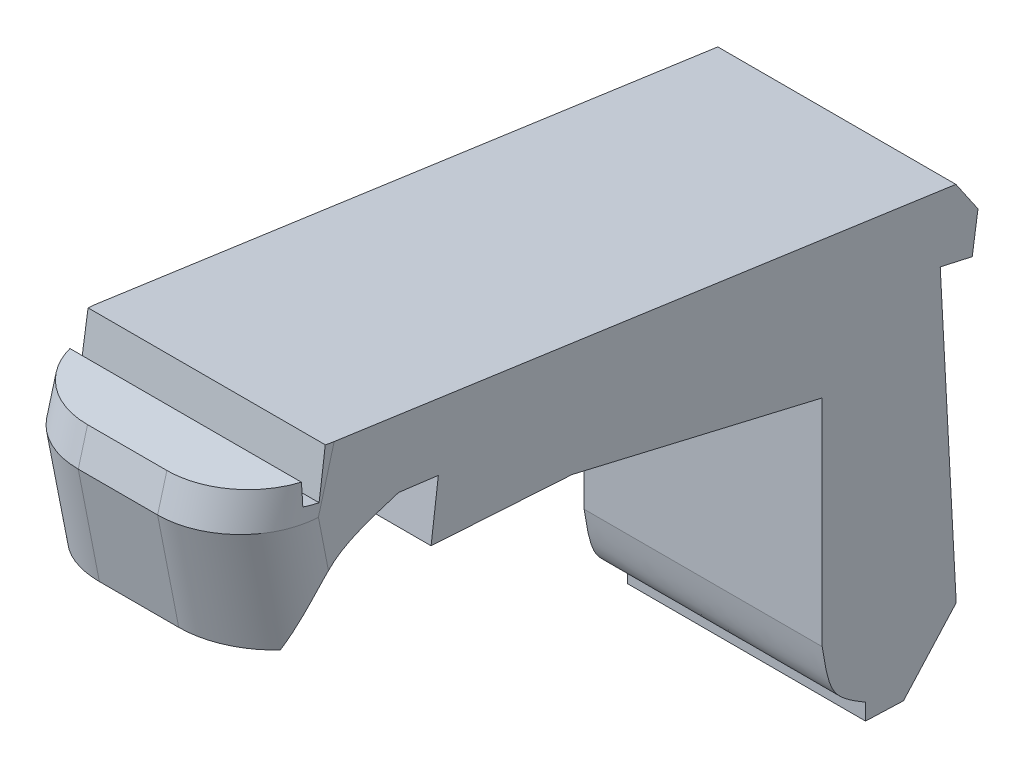
ISO-10303-21;
HEADER;
FILE_DESCRIPTION(('STEP AP214'),'2;1');
FILE_NAME('part.step','',(''),(''),'','','');
FILE_SCHEMA(('AUTOMOTIVE_DESIGN { 1 0 10303 214 1 1 1 1 }'));
ENDSEC;
DATA;
#1=APPLICATION_CONTEXT('core data for automotive mechanical design processes');
#2=APPLICATION_PROTOCOL_DEFINITION('international standard','automotive_design',2000,#1);
#3=PRODUCT_CONTEXT('',#1,'mechanical');
#4=PRODUCT('Part','Part','',(#3));
#5=PRODUCT_RELATED_PRODUCT_CATEGORY('part','',(#4));
#6=PRODUCT_DEFINITION_FORMATION('','',#4);
#7=PRODUCT_DEFINITION_CONTEXT('part definition',#1,'design');
#8=PRODUCT_DEFINITION('design','',#6,#7);
#9=PRODUCT_DEFINITION_SHAPE('','',#8);
#10=(LENGTH_UNIT() NAMED_UNIT(*) SI_UNIT(.MILLI.,.METRE.));
#11=(NAMED_UNIT(*) PLANE_ANGLE_UNIT() SI_UNIT($,.RADIAN.));
#12=(NAMED_UNIT(*) SI_UNIT($,.STERADIAN.) SOLID_ANGLE_UNIT());
#13=UNCERTAINTY_MEASURE_WITH_UNIT(LENGTH_MEASURE(1.E-05),#10,'distance_accuracy_value','');
#14=(GEOMETRIC_REPRESENTATION_CONTEXT(3) GLOBAL_UNCERTAINTY_ASSIGNED_CONTEXT((#13)) GLOBAL_UNIT_ASSIGNED_CONTEXT((#10,
#11,#12)) REPRESENTATION_CONTEXT('',''));
#15=CARTESIAN_POINT('',(0.,0.,0.));
#16=DIRECTION('',(0.,0.,1.));
#17=DIRECTION('',(1.,0.,0.));
#18=AXIS2_PLACEMENT_3D('',#15,#16,#17);
#19=CARTESIAN_POINT('',(457.2,-234.202580834707,-700.473544690758));
#20=DIRECTION('',(0.,0.147906441094349,0.989001357270456));
#21=DIRECTION('',(0.,-0.989001357270456,0.147906441094349));
#22=AXIS2_PLACEMENT_3D('',#19,#20,#21);
#23=PLANE('',#22);
#24=DIRECTION('',(0.,0.989001357270456,-0.147906441094349));
#25=VECTOR('',#24,1.);
#26=CARTESIAN_POINT('',(0.,-234.202580834707,-700.473544690758));
#27=LINE('',#26,#25);
#28=CARTESIAN_POINT('',(0.,-234.202580834707,-700.473544690758));
#29=VERTEX_POINT('',#28);
#30=CARTESIAN_POINT('',(0.,-160.150025750479,-711.548200752586));
#31=VERTEX_POINT('',#30);
#32=EDGE_CURVE('E240',#29,#31,#27,.T.);
#33=ORIENTED_EDGE('',*,*,#32,.T.);
#34=DIRECTION('',(-1.,0.,0.));
#35=VECTOR('',#34,1.);
#36=CARTESIAN_POINT('',(457.2,-160.150025750479,-711.548200752586));
#37=LINE('',#36,#35);
#38=CARTESIAN_POINT('',(457.2,-160.150025750479,-711.548200752586));
#39=VERTEX_POINT('',#38);
#40=EDGE_CURVE('E220',#39,#31,#37,.T.);
#41=ORIENTED_EDGE('',*,*,#40,.F.);
#42=DIRECTION('',(0.,0.989001357270456,-0.147906441094349));
#43=VECTOR('',#42,1.);
#44=CARTESIAN_POINT('',(457.2,-234.202580834707,-700.473544690758));
#45=LINE('',#44,#43);
#46=CARTESIAN_POINT('',(457.2,-234.202580834707,-700.473544690758));
#47=VERTEX_POINT('',#46);
#48=EDGE_CURVE('E227',#47,#39,#45,.T.);
#49=ORIENTED_EDGE('',*,*,#48,.F.);
#50=DIRECTION('',(-1.,0.,0.));
#51=VECTOR('',#50,1.);
#52=CARTESIAN_POINT('',(457.2,-234.202580834707,-700.473544690758));
#53=LINE('',#52,#51);
#54=EDGE_CURVE('E509',#47,#29,#53,.T.);
#55=ORIENTED_EDGE('',*,*,#54,.T.);
#56=EDGE_LOOP('',(#33,#41,#49,#55));
#57=FACE_BOUND('',#56,.T.);
#58=ADVANCED_FACE('F44',(#57),#23,.F.);
#59=CARTESIAN_POINT('',(457.2,-160.150025750479,-711.548200752586));
#60=DIRECTION('',(0.,-0.565365169985274,0.824840726787616));
#61=DIRECTION('',(0.,-0.824840726787616,-0.565365169985274));
#62=AXIS2_PLACEMENT_3D('',#59,#60,#61);
#63=PLANE('',#62);
#64=DIRECTION('',(0.,0.824840726787616,0.565365169985274));
#65=VECTOR('',#64,1.);
#66=CARTESIAN_POINT('',(0.,-160.150025750479,-711.548200752586));
#67=LINE('',#66,#65);
#68=CARTESIAN_POINT('',(0.,-98.1665415570775,-669.063267674949));
#69=VERTEX_POINT('',#68);
#70=EDGE_CURVE('E424',#31,#69,#67,.T.);
#71=ORIENTED_EDGE('',*,*,#70,.T.);
#72=DIRECTION('',(-1.,0.,0.));
#73=VECTOR('',#72,1.);
#74=CARTESIAN_POINT('',(457.2,-98.1665415570775,-669.063267674949));
#75=LINE('',#74,#73);
#76=CARTESIAN_POINT('',(457.2,-98.1665415570775,-669.063267674949));
#77=VERTEX_POINT('',#76);
#78=EDGE_CURVE('E223',#77,#69,#75,.T.);
#79=ORIENTED_EDGE('',*,*,#78,.F.);
#80=DIRECTION('',(0.,0.824840726787616,0.565365169985274));
#81=VECTOR('',#80,1.);
#82=CARTESIAN_POINT('',(457.2,-160.150025750479,-711.548200752586));
#83=LINE('',#82,#81);
#84=EDGE_CURVE('E216',#39,#77,#83,.T.);
#85=ORIENTED_EDGE('',*,*,#84,.F.);
#86=ORIENTED_EDGE('',*,*,#40,.T.);
#87=EDGE_LOOP('',(#71,#79,#85,#86));
#88=FACE_BOUND('',#87,.T.);
#89=ADVANCED_FACE('F218',(#88),#63,.F.);
#90=CARTESIAN_POINT('',(457.2,-98.1665415570775,-669.063267674949));
#91=DIRECTION('',(0.,-0.990108755440393,0.140302004263217));
#92=DIRECTION('',(0.,-0.140302004263217,-0.990108755440393));
#93=AXIS2_PLACEMENT_3D('',#90,#91,#92);
#94=PLANE('',#93);
#95=DIRECTION('',(0.,0.140302004263217,0.990108755440393));
#96=VECTOR('',#95,1.);
#97=CARTESIAN_POINT('',(0.,-98.1665415570775,-669.063267674949));
#98=LINE('',#97,#96);
#99=CARTESIAN_POINT('',(0.,71.0241120864936,524.912174022294));
#100=VERTEX_POINT('',#99);
#101=EDGE_CURVE('E462',#69,#100,#98,.T.);
#102=ORIENTED_EDGE('',*,*,#101,.T.);
#103=CARTESIAN_POINT('',(152.4,71.0241120864935,524.912174022294));
#104=DIRECTION('',(0.,-0.990108755440393,0.140302004263217));
#105=DIRECTION('',(0.,0.140302004263217,0.990108755440393));
#106=AXIS2_PLACEMENT_3D('',#103,#104,#105);
#107=ELLIPSE('',#106,153.614203620761,152.4);
#108=CARTESIAN_POINT('',(0.869292960390344,73.3228033929576,541.133997798345));
#109=VERTEX_POINT('',#108);
#110=EDGE_CURVE('E377',#100,#109,#107,.F.);
#111=ORIENTED_EDGE('',*,*,#110,.T.);
#112=DIRECTION('',(-1.,0.,0.));
#113=VECTOR('',#112,1.);
#114=CARTESIAN_POINT('',(457.2,73.3228033929576,541.133997798345));
#115=LINE('',#114,#113);
#116=CARTESIAN_POINT('',(456.33070703961,73.3228033929576,541.133997798345));
#117=VERTEX_POINT('',#116);
#118=EDGE_CURVE('E248',#117,#109,#115,.T.);
#119=ORIENTED_EDGE('',*,*,#118,.F.);
#120=CARTESIAN_POINT('',(304.8,71.0241120864935,524.912174022294));
#121=DIRECTION('',(0.,-0.990108755440393,0.140302004263217));
#122=DIRECTION('',(0.,-0.140302004263217,-0.990108755440393));
#123=AXIS2_PLACEMENT_3D('',#120,#121,#122);
#124=ELLIPSE('',#123,153.614203620761,152.4);
#125=CARTESIAN_POINT('',(457.2,71.0241120864936,524.912174022294));
#126=VERTEX_POINT('',#125);
#127=EDGE_CURVE('E389',#117,#126,#124,.F.);
#128=ORIENTED_EDGE('',*,*,#127,.T.);
#129=DIRECTION('',(0.,0.140302004263217,0.990108755440393));
#130=VECTOR('',#129,1.);
#131=CARTESIAN_POINT('',(457.2,-98.1665415570775,-669.063267674949));
#132=LINE('',#131,#130);
#133=EDGE_CURVE('E226',#77,#126,#132,.T.);
#134=ORIENTED_EDGE('',*,*,#133,.F.);
#135=ORIENTED_EDGE('',*,*,#78,.T.);
#136=EDGE_LOOP('',(#102,#111,#119,#128,#134,#135));
#137=FACE_BOUND('',#136,.T.);
#138=ADVANCED_FACE('F358',(#137),#94,.F.);
#139=CARTESIAN_POINT('',(457.2,73.3228033929576,541.133997798345));
#140=DIRECTION('',(0.,-0.140302004263217,-0.990108755440393));
#141=DIRECTION('',(0.,0.990108755440393,-0.140302004263217));
#142=AXIS2_PLACEMENT_3D('',#139,#140,#141);
#143=PLANE('',#142);
#144=ORIENTED_EDGE('',*,*,#118,.T.);
#145=CARTESIAN_POINT('',(152.4,-54.930361816575,559.307936805677));
#146=DIRECTION('',(0.,-0.140302004263217,-0.990108755440393));
#147=DIRECTION('',(0.,-0.990108755440393,0.140302004263217));
#148=AXIS2_PLACEMENT_3D('',#145,#146,#147);
#149=ELLIPSE('',#148,1214.50634080921,152.4);
#150=CARTESIAN_POINT('',(0.0789153787404406,-16.2375941304493,553.825031188465));
#151=VERTEX_POINT('',#150);
#152=EDGE_CURVE('E382',#109,#151,#149,.F.);
#153=ORIENTED_EDGE('',*,*,#152,.T.);
#154=DIRECTION('',(-1.,0.,0.));
#155=VECTOR('',#154,1.);
#156=CARTESIAN_POINT('',(457.2,-16.2375941304493,553.825031188465));
#157=LINE('',#156,#155);
#158=CARTESIAN_POINT('',(457.12108462126,-16.2375941304493,553.825031188465));
#159=VERTEX_POINT('',#158);
#160=EDGE_CURVE('E574',#159,#151,#157,.T.);
#161=ORIENTED_EDGE('',*,*,#160,.F.);
#162=CARTESIAN_POINT('',(304.8,-54.9303618165749,559.307936805677));
#163=DIRECTION('',(0.,-0.140302004263217,-0.990108755440393));
#164=DIRECTION('',(0.,0.990108755440393,-0.140302004263217));
#165=AXIS2_PLACEMENT_3D('',#162,#163,#164);
#166=ELLIPSE('',#165,1214.50634080921,152.4);
#167=EDGE_CURVE('E388',#159,#117,#166,.F.);
#168=ORIENTED_EDGE('',*,*,#167,.T.);
#169=EDGE_LOOP('',(#144,#153,#161,#168));
#170=FACE_BOUND('',#169,.T.);
#171=ADVANCED_FACE('F579',(#170),#143,.F.);
#172=CARTESIAN_POINT('',(457.2,-16.2375941304493,553.825031188465));
#173=DIRECTION('',(0.,-0.985030467155704,0.172380331752249));
#174=DIRECTION('',(0.,-0.172380331752249,-0.985030467155704));
#175=AXIS2_PLACEMENT_3D('',#172,#173,#174);
#176=PLANE('',#175);
#177=ORIENTED_EDGE('',*,*,#160,.T.);
#178=CARTESIAN_POINT('',(152.4,-17.0866069004241,548.973529645752));
#179=DIRECTION('',(0.,-0.985030467155704,0.172380331752249));
#180=DIRECTION('',(0.,0.172380331752249,0.985030467155704));
#181=AXIS2_PLACEMENT_3D('',#178,#179,#180);
#182=ELLIPSE('',#181,153.066235733513,152.4);
#183=CARTESIAN_POINT('',(3.58685019918575,-11.3957753505241,581.492567073753));
#184=VERTEX_POINT('',#183);
#185=EDGE_CURVE('E403',#151,#184,#182,.F.);
#186=ORIENTED_EDGE('',*,*,#185,.T.);
#187=DIRECTION('',(-1.,0.,0.));
#188=VECTOR('',#187,1.);
#189=CARTESIAN_POINT('',(457.2,-11.3957753505241,581.492567073753));
#190=LINE('',#189,#188);
#191=CARTESIAN_POINT('',(453.613149800814,-11.3957753505241,581.492567073753));
#192=VERTEX_POINT('',#191);
#193=EDGE_CURVE('E571',#192,#184,#190,.T.);
#194=ORIENTED_EDGE('',*,*,#193,.F.);
#195=CARTESIAN_POINT('',(304.8,-17.0866069004242,548.973529645752));
#196=DIRECTION('',(0.,-0.985030467155704,0.172380331752249));
#197=DIRECTION('',(0.,-0.172380331752249,-0.985030467155704));
#198=AXIS2_PLACEMENT_3D('',#195,#196,#197);
#199=ELLIPSE('',#198,153.066235733513,152.4);
#200=EDGE_CURVE('E400',#192,#159,#199,.F.);
#201=ORIENTED_EDGE('',*,*,#200,.T.);
#202=EDGE_LOOP('',(#177,#186,#194,#201));
#203=FACE_BOUND('',#202,.T.);
#204=ADVANCED_FACE('F585',(#203),#176,.F.);
#205=CARTESIAN_POINT('',(457.2,-11.3957753505241,581.492567073753));
#206=DIRECTION('',(0.,0.,1.));
#207=DIRECTION('',(1.,0.,0.));
#208=AXIS2_PLACEMENT_3D('',#205,#206,#207);
#209=PLANE('',#208);
#210=ORIENTED_EDGE('',*,*,#193,.T.);
#211=CARTESIAN_POINT('',(152.4,-136.168665841031,581.492567073753));
#212=DIRECTION('',(0.,0.,1.));
#213=DIRECTION('',(0.,-1.,0.));
#214=AXIS2_PLACEMENT_3D('',#211,#212,#213);
#215=ELLIPSE('',#214,578.510997998352,152.4);
#216=CARTESIAN_POINT('',(6.31289711011646,28.6110667005303,581.492567073753));
#217=VERTEX_POINT('',#216);
#218=EDGE_CURVE('E68',#184,#217,#215,.F.);
#219=ORIENTED_EDGE('',*,*,#218,.T.);
#220=DIRECTION('',(-1.,0.,0.));
#221=VECTOR('',#220,1.);
#222=CARTESIAN_POINT('',(457.2,28.6110667005303,581.492567073753));
#223=LINE('',#222,#221);
#224=CARTESIAN_POINT('',(450.887102889884,28.6110667005303,581.492567073753));
#225=VERTEX_POINT('',#224);
#226=EDGE_CURVE('E568',#225,#217,#223,.T.);
#227=ORIENTED_EDGE('',*,*,#226,.F.);
#228=CARTESIAN_POINT('',(304.8,-136.168665841031,581.492567073753));
#229=DIRECTION('',(0.,0.,1.));
#230=DIRECTION('',(0.,1.,0.));
#231=AXIS2_PLACEMENT_3D('',#228,#229,#230);
#232=ELLIPSE('',#231,578.510997998352,152.4);
#233=EDGE_CURVE('E406',#225,#192,#232,.F.);
#234=ORIENTED_EDGE('',*,*,#233,.T.);
#235=EDGE_LOOP('',(#210,#219,#227,#234));
#236=FACE_BOUND('',#235,.T.);
#237=ADVANCED_FACE('F586',(#236),#209,.F.);
#238=CARTESIAN_POINT('',(457.2,28.6110667005303,581.492567073753));
#239=DIRECTION('',(0.,-0.999735868986412,0.0229824337698023));
#240=DIRECTION('',(0.,-0.0229824337698023,-0.999735868986412));
#241=AXIS2_PLACEMENT_3D('',#238,#239,#240);
#242=PLANE('',#241);
#243=ORIENTED_EDGE('',*,*,#226,.T.);
#244=CARTESIAN_POINT('',(152.4,27.5830787468075,536.77509108681));
#245=DIRECTION('',(0.,-0.999735868986412,0.0229824337698023));
#246=DIRECTION('',(0.,0.0229824337698023,0.999735868986412));
#247=AXIS2_PLACEMENT_3D('',#244,#245,#246);
#248=ELLIPSE('',#247,157.036220524386,152.4);
#249=CARTESIAN_POINT('',(152.4,31.1921532844693,693.769833475099));
#250=VERTEX_POINT('',#249);
#251=EDGE_CURVE('E414',#217,#250,#248,.F.);
#252=ORIENTED_EDGE('',*,*,#251,.T.);
#253=DIRECTION('',(-1.,0.,0.));
#254=VECTOR('',#253,1.);
#255=CARTESIAN_POINT('',(457.2,31.1921532844693,693.769833475099));
#256=LINE('',#255,#254);
#257=CARTESIAN_POINT('',(304.8,31.1921532844693,693.769833475099));
#258=VERTEX_POINT('',#257);
#259=EDGE_CURVE('E565',#258,#250,#256,.T.);
#260=ORIENTED_EDGE('',*,*,#259,.F.);
#261=CARTESIAN_POINT('',(304.8,27.5830787468075,536.77509108681));
#262=DIRECTION('',(0.,-0.999735868986412,0.0229824337698023));
#263=DIRECTION('',(0.,-0.0229824337698023,-0.999735868986412));
#264=AXIS2_PLACEMENT_3D('',#261,#262,#263);
#265=ELLIPSE('',#264,157.036220524386,152.4);
#266=EDGE_CURVE('E411',#258,#225,#265,.F.);
#267=ORIENTED_EDGE('',*,*,#266,.T.);
#268=EDGE_LOOP('',(#243,#252,#260,#267));
#269=FACE_BOUND('',#268,.T.);
#270=ADVANCED_FACE('F590',(#269),#242,.F.);
#271=CARTESIAN_POINT('',(457.2,31.1921532844693,693.769833475099));
#272=DIRECTION('',(0.,-0.263434922632939,-0.96467716959477));
#273=DIRECTION('',(0.,0.964677169594771,-0.263434922632939));
#274=AXIS2_PLACEMENT_3D('',#271,#272,#273);
#275=PLANE('',#274);
#276=ORIENTED_EDGE('',*,*,#259,.T.);
#277=DIRECTION('',(0.,-0.964677169594771,0.263434922632939));
#278=VECTOR('',#277,1.);
#279=CARTESIAN_POINT('',(152.4,31.1921532844693,693.769833475099));
#280=LINE('',#279,#278);
#281=CARTESIAN_POINT('',(152.4,-33.910775567373,711.548200752586));
#282=VERTEX_POINT('',#281);
#283=EDGE_CURVE('E394',#250,#282,#280,.T.);
#284=ORIENTED_EDGE('',*,*,#283,.T.);
#285=DIRECTION('',(-1.,0.,0.));
#286=VECTOR('',#285,1.);
#287=CARTESIAN_POINT('',(457.2,-33.910775567373,711.548200752586));
#288=LINE('',#287,#286);
#289=CARTESIAN_POINT('',(304.8,-33.910775567373,711.548200752586));
#290=VERTEX_POINT('',#289);
#291=EDGE_CURVE('E561',#290,#282,#288,.T.);
#292=ORIENTED_EDGE('',*,*,#291,.F.);
#293=DIRECTION('',(0.,-0.964677169594771,0.263434922632939));
#294=VECTOR('',#293,1.);
#295=CARTESIAN_POINT('',(304.8,31.1921532844693,693.769833475099));
#296=LINE('',#295,#294);
#297=EDGE_CURVE('E435',#290,#258,#296,.F.);
#298=ORIENTED_EDGE('',*,*,#297,.T.);
#299=EDGE_LOOP('',(#276,#284,#292,#298));
#300=FACE_BOUND('',#299,.T.);
#301=ADVANCED_FACE('F591',(#300),#275,.F.);
#302=CARTESIAN_POINT('',(457.2,-33.910775567373,711.548200752586));
#303=DIRECTION('',(0.,0.191799309114282,-0.981434167442363));
#304=DIRECTION('',(0.,0.981434167442363,0.191799309114282));
#305=AXIS2_PLACEMENT_3D('',#302,#303,#304);
#306=PLANE('',#305);
#307=ORIENTED_EDGE('',*,*,#291,.T.);
#308=DIRECTION('',(0.,-0.981434167442363,-0.191799309114282));
#309=VECTOR('',#308,1.);
#310=CARTESIAN_POINT('',(152.4,-33.910775567373,711.548200752586));
#311=LINE('',#310,#309);
#312=CARTESIAN_POINT('',(152.4,-241.199727441152,671.038221504539));
#313=VERTEX_POINT('',#312);
#314=EDGE_CURVE('E246',#282,#313,#311,.T.);
#315=ORIENTED_EDGE('',*,*,#314,.T.);
#316=DIRECTION('',(-1.,0.,0.));
#317=VECTOR('',#316,1.);
#318=CARTESIAN_POINT('',(457.2,-241.199727441152,671.038221504539));
#319=LINE('',#318,#317);
#320=CARTESIAN_POINT('',(304.8,-241.199727441152,671.038221504539));
#321=VERTEX_POINT('',#320);
#322=EDGE_CURVE('E557',#321,#313,#319,.T.);
#323=ORIENTED_EDGE('',*,*,#322,.F.);
#324=DIRECTION('',(0.,-0.981434167442363,-0.191799309114282));
#325=VECTOR('',#324,1.);
#326=CARTESIAN_POINT('',(304.8,-33.910775567373,711.548200752586));
#327=LINE('',#326,#325);
#328=EDGE_CURVE('E242',#321,#290,#327,.F.);
#329=ORIENTED_EDGE('',*,*,#328,.T.);
#330=EDGE_LOOP('',(#307,#315,#323,#329));
#331=FACE_BOUND('',#330,.T.);
#332=ADVANCED_FACE('F593',(#331),#306,.F.);
#333=CARTESIAN_POINT('',(457.2,-241.199727441152,671.038221504539));
#334=DIRECTION('',(0.,0.991075478634725,-0.133301896644238));
#335=DIRECTION('',(0.,0.133301896644238,0.991075478634725));
#336=AXIS2_PLACEMENT_3D('',#333,#334,#335);
#337=PLANE('',#336);
#338=ORIENTED_EDGE('',*,*,#322,.T.);
#339=CARTESIAN_POINT('',(152.4,-262.649452662792,511.56339612111));
#340=DIRECTION('',(0.,0.991075478634725,-0.133301896644238));
#341=DIRECTION('',(0.,-0.133301896644238,-0.991075478634725));
#342=AXIS2_PLACEMENT_3D('',#339,#340,#341);
#343=ELLIPSE('',#342,160.910877951613,152.4);
#344=CARTESIAN_POINT('',(26.6621561789793,-250.529122735342,601.675855781883));
#345=VERTEX_POINT('',#344);
#346=EDGE_CURVE('E258',#313,#345,#343,.F.);
#347=ORIENTED_EDGE('',*,*,#346,.T.);
#348=DIRECTION('',(-1.,0.,0.));
#349=VECTOR('',#348,1.);
#350=CARTESIAN_POINT('',(457.2,-250.529122735342,601.675855781883));
#351=LINE('',#350,#349);
#352=CARTESIAN_POINT('',(430.537843821021,-250.529122735342,601.675855781883));
#353=VERTEX_POINT('',#352);
#354=EDGE_CURVE('E457',#353,#345,#351,.T.);
#355=ORIENTED_EDGE('',*,*,#354,.F.);
#356=CARTESIAN_POINT('',(304.8,-262.649452662792,511.56339612111));
#357=DIRECTION('',(0.,0.991075478634725,-0.133301896644238));
#358=DIRECTION('',(0.,0.133301896644238,0.991075478634725));
#359=AXIS2_PLACEMENT_3D('',#356,#357,#358);
#360=ELLIPSE('',#359,160.910877951613,152.4);
#361=EDGE_CURVE('E255',#353,#321,#360,.F.);
#362=ORIENTED_EDGE('',*,*,#361,.T.);
#363=EDGE_LOOP('',(#338,#347,#355,#362));
#364=FACE_BOUND('',#363,.T.);
#365=ADVANCED_FACE('F286',(#364),#337,.F.);
#366=CARTESIAN_POINT('',(457.2,-250.529122735342,601.675855781883));
#367=CARTESIAN_POINT('',(457.2,-117.433049010469,541.133997798345));
#368=CARTESIAN_POINT('',(457.2,-75.5457620291757,401.043539170991));
#369=(BOUNDED_CURVE() B_SPLINE_CURVE(2,(#366,#367,#368),.UNSPECIFIED.,.F.,
.F.) B_SPLINE_CURVE_WITH_KNOTS((3,3),(0.,1.),
.UNSPECIFIED.) CURVE() GEOMETRIC_REPRESENTATION_ITEM() RATIONAL_B_SPLINE_CURVE((1.,
2.24601970308913,1.)) REPRESENTATION_ITEM(''));
#370=DIRECTION('',(-1.,0.,0.));
#371=VECTOR('',#370,1.);
#372=SURFACE_OF_LINEAR_EXTRUSION('',#369,#371);
#373=ORIENTED_EDGE('',*,*,#354,.T.);
#374=CARTESIAN_POINT('',(26.6621561789793,-250.529122735342,601.675855781883));
#375=CARTESIAN_POINT('',(26.2106477380945,-249.496170528896,601.205991803243));
#376=CARTESIAN_POINT('',(25.76524101888,-248.461426677405,600.734232278951));
#377=CARTESIAN_POINT('',(24.8864620083956,-246.388601035078,599.786866011765));
#378=CARTESIAN_POINT('',(24.4530896655361,-245.350519258573,599.311259285374));
#379=CARTESIAN_POINT('',(23.1703632225893,-242.230644657205,597.878129211071));
#380=CARTESIAN_POINT('',(22.3388237395048,-240.144193825704,596.914737455755));
#381=CARTESIAN_POINT('',(20.7217392446578,-235.960099438394,594.971315029182));
#382=CARTESIAN_POINT('',(19.9362133616806,-233.862451617652,593.991277653353));
#383=CARTESIAN_POINT('',(18.4102232858541,-229.65813468606,592.013720803508));
#384=CARTESIAN_POINT('',(17.669773258115,-227.551462959785,591.01619595959));
#385=CARTESIAN_POINT('',(16.2331507196558,-223.331384288853,589.002545420452));
#386=CARTESIAN_POINT('',(15.5369867245251,-221.217976130424,587.98641619595));
#387=CARTESIAN_POINT('',(14.1882856176697,-216.986817274965,585.934082554199));
#388=CARTESIAN_POINT('',(13.5357511757078,-214.869066320351,584.897876913434));
#389=CARTESIAN_POINT('',(12.2862771488451,-210.673650646273,582.824187341796));
#390=CARTESIAN_POINT('',(11.6884916413633,-208.596023883992,581.787136328056));
#391=CARTESIAN_POINT('',(10.5339697563553,-204.441414909089,579.689523771954));
#392=CARTESIAN_POINT('',(9.97723054885528,-202.364432661881,578.628963857005));
#393=CARTESIAN_POINT('',(8.90465027507954,-198.213874531978,576.481417828276));
#394=CARTESIAN_POINT('',(8.38880454970633,-196.140298287667,575.394434743445));
#395=CARTESIAN_POINT('',(7.39808874692426,-191.999636095368,573.19040294618));
#396=CARTESIAN_POINT('',(6.92321397504697,-189.932549430025,572.073357697574));
#397=CARTESIAN_POINT('',(6.0148106948,-185.808365974523,569.80467934955));
#398=CARTESIAN_POINT('',(5.58128076137426,-183.751268842369,568.653047444051));
#399=CARTESIAN_POINT('',(4.75629867307604,-179.650986813389,566.309567879174));
#400=CARTESIAN_POINT('',(4.36485411187332,-177.607804489364,565.117713012974));
#401=CARTESIAN_POINT('',(3.79440153818699,-174.470022769758,563.242638689223));
#402=CARTESIAN_POINT('',(3.60002912150339,-173.368424439535,562.575755852381));
#403=CARTESIAN_POINT('',(3.22446574665195,-171.172132177813,561.227150171203));
#404=CARTESIAN_POINT('',(3.04327424364687,-170.077437962642,560.545427941773));
#405=CARTESIAN_POINT('',(2.69448196195254,-167.896311682356,559.16604835528));
#406=CARTESIAN_POINT('',(2.52687799018134,-166.809877730775,558.468394791775));
#407=CARTESIAN_POINT('',(2.20573026447327,-164.646684977326,557.055936858155));
#408=CARTESIAN_POINT('',(2.05218134872719,-163.569922755545,556.341138907128));
#409=CARTESIAN_POINT('',(1.75968385075708,-161.427546601749,554.89307422278));
#410=CARTESIAN_POINT('',(1.62072907055477,-160.361928111656,554.159815494924));
#411=CARTESIAN_POINT('',(1.35804330194618,-158.243364167064,552.673413061468));
#412=CARTESIAN_POINT('',(1.23430635452631,-157.190413898585,551.920277280565));
#413=CARTESIAN_POINT('',(1.00152800704004,-155.087479046643,550.384388248193));
#414=CARTESIAN_POINT('',(0.892654978946024,-154.037642309958,549.601406706469));
#415=CARTESIAN_POINT('',(0.692052927547382,-151.954140640214,548.011971083726));
#416=CARTESIAN_POINT('',(0.600324514848538,-150.920476284335,547.205516167885));
#417=CARTESIAN_POINT('',(0.434999131704221,-148.870990906182,545.567511131434));
#418=CARTESIAN_POINT('',(0.361409916474956,-147.855177687742,544.735950447082));
#419=CARTESIAN_POINT('',(0.233487870817451,-145.843049482785,543.046140462907));
#420=CARTESIAN_POINT('',(0.17917381024294,-144.846754389591,542.187866029207));
#421=CARTESIAN_POINT('',(0.0910710446154932,-142.875220050631,540.443073560874));
#422=CARTESIAN_POINT('',(0.0573169739733838,-141.900018988884,539.5565105012));
#423=CARTESIAN_POINT('',(0.0231590400354881,-140.454774981873,538.205066955019));
#424=CARTESIAN_POINT('',(0.0145181255919278,-139.975348036487,537.75038725661));
#425=CARTESIAN_POINT('',(0.00293873441569719,-139.023028538406,536.834147502068));
#426=CARTESIAN_POINT('',(3.62912073798033E-07,-138.550136106452,536.372587319129));
#427=CARTESIAN_POINT('',(-3.05311331771918E-13,-138.080637378436,535.907578850134));
#428=B_SPLINE_CURVE_WITH_KNOTS('',3,(#374,#375,#376,#377,#378,#379,#380,#381,#382,#383,#384,
#385,#386,#387,#388,#389,#390,#391,#392,#393,#394,#395,#396,#397,#398,#399,#400,#401,#402,#403,
#404,#405,#406,#407,#408,#409,#410,#411,#412,#413,#414,#415,#416,#417,#418,#419,#420,#421,#422,
#423,#424,#425,#426,#427),.UNSPECIFIED.,.F.,.F.,(4,2,2,2,2,2,2,2,2,2,2,2,2,2,2,2,2,2,2,2,2,2,2,
2,2,2,4),(0.,3.66392059858337,7.32782548805145,14.6590787801036,21.9933585030189,
29.3299312542697,36.6679104888678,44.0063383361027,51.1992273855399,58.3916200501428,
65.5831920860897,72.7739390114321,79.9644379995666,87.1562322349022,91.0630453928432,
94.9696969695534,98.875427802226,102.779718426338,106.68234417624,110.583436833318,
114.525587205026,118.467877949748,122.411851265798,126.359654692501,130.314090146342,
132.296413110528,134.27877265418),.UNSPECIFIED.);
#429=CARTESIAN_POINT('',(0.,-138.080637378436,535.907578850134));
#430=VERTEX_POINT('',#429);
#431=EDGE_CURVE('E269',#345,#430,#428,.T.);
#432=ORIENTED_EDGE('',*,*,#431,.T.);
#433=CARTESIAN_POINT('',(0.,-250.529122735342,601.675855781883));
#434=CARTESIAN_POINT('',(0.,-117.433049010469,541.133997798345));
#435=CARTESIAN_POINT('',(0.,-75.5457620291757,401.043539170991));
#436=(BOUNDED_CURVE() B_SPLINE_CURVE(2,(#433,#434,#435),.UNSPECIFIED.,.F.,
.F.) B_SPLINE_CURVE_WITH_KNOTS((3,3),(0.,1.),
.UNSPECIFIED.) CURVE() GEOMETRIC_REPRESENTATION_ITEM() RATIONAL_B_SPLINE_CURVE((1.,
2.24601970308913,1.)) REPRESENTATION_ITEM(''));
#437=CARTESIAN_POINT('',(0.,-75.5457620291757,401.043539170991));
#438=VERTEX_POINT('',#437);
#439=EDGE_CURVE('E454',#430,#438,#436,.T.);
#440=ORIENTED_EDGE('',*,*,#439,.T.);
#441=DIRECTION('',(-1.,0.,0.));
#442=VECTOR('',#441,1.);
#443=CARTESIAN_POINT('',(457.2,-75.5457620291757,401.043539170991));
#444=LINE('',#443,#442);
#445=CARTESIAN_POINT('',(457.2,-75.5457620291757,401.043539170991));
#446=VERTEX_POINT('',#445);
#447=EDGE_CURVE('E552',#446,#438,#444,.T.);
#448=ORIENTED_EDGE('',*,*,#447,.F.);
#449=CARTESIAN_POINT('',(457.2,-138.080637378436,535.907578850134));
#450=VERTEX_POINT('',#449);
#451=EDGE_CURVE('E291',#450,#446,#369,.T.);
#452=ORIENTED_EDGE('',*,*,#451,.F.);
#453=CARTESIAN_POINT('',(457.2,-138.080637378436,535.907578850134));
#454=CARTESIAN_POINT('',(457.199998214387,-138.751011721921,536.571562977279));
#455=CARTESIAN_POINT('',(457.19400824852,-139.428329476575,537.228506546974));
#456=CARTESIAN_POINT('',(457.170552870656,-140.796037685119,538.528359867369));
#457=CARTESIAN_POINT('',(457.153088095452,-141.486427411515,539.171270394787));
#458=CARTESIAN_POINT('',(457.107293501013,-142.876213872133,540.440141840884));
#459=CARTESIAN_POINT('',(457.079015961883,-143.57555185472,541.066169036468));
#460=CARTESIAN_POINT('',(457.012063208937,-144.98563839287,542.304662166049));
#461=CARTESIAN_POINT('',(456.973387851218,-145.696387106228,542.91712791223));
#462=CARTESIAN_POINT('',(456.842705640587,-147.840344903829,544.731062704639));
#463=CARTESIAN_POINT('',(456.735901117614,-149.289399385437,545.912831059333));
#464=CARTESIAN_POINT('',(456.486225838464,-152.221135500257,548.225002953282));
#465=CARTESIAN_POINT('',(456.343409742179,-153.70376309806,549.355481301528));
#466=CARTESIAN_POINT('',(456.024474050688,-156.698207561057,551.570364743347));
#467=CARTESIAN_POINT('',(455.848372592706,-158.210008128911,552.654794536543));
#468=CARTESIAN_POINT('',(455.46507010245,-161.258490753497,554.78248197489));
#469=CARTESIAN_POINT('',(455.257867182613,-162.795174315335,555.825737116277));
#470=CARTESIAN_POINT('',(454.817043599211,-165.868843947975,557.861936860356));
#471=CARTESIAN_POINT('',(454.583798968707,-167.405569435876,558.855357422574));
#472=CARTESIAN_POINT('',(454.089951790828,-170.496195283917,560.810586835827));
#473=CARTESIAN_POINT('',(453.829329599184,-172.050107250684,561.772372328915));
#474=CARTESIAN_POINT('',(453.281706161455,-175.171935750111,563.667733371817));
#475=CARTESIAN_POINT('',(452.994686460597,-176.739861377787,564.601288570279));
#476=CARTESIAN_POINT('',(452.39502525629,-179.88678338079,566.443113092248));
#477=CARTESIAN_POINT('',(452.082369913699,-181.465785309352,567.351368398702));
#478=CARTESIAN_POINT('',(451.432025159468,-184.632145999072,569.145082444538));
#479=CARTESIAN_POINT('',(451.094328776435,-186.219506972251,570.030534742455));
#480=CARTESIAN_POINT('',(450.394361068458,-189.400072273369,571.78074468533));
#481=CARTESIAN_POINT('',(450.0320911468,-190.993276262732,572.645503508191));
#482=CARTESIAN_POINT('',(449.281147089884,-194.192532180306,574.361096532961));
#483=CARTESIAN_POINT('',(448.89234071234,-195.798606986118,575.211830094436));
#484=CARTESIAN_POINT('',(448.090345419148,-199.012823450931,576.896016396985));
#485=CARTESIAN_POINT('',(447.67716675003,-200.620963967205,577.729476203875));
#486=CARTESIAN_POINT('',(446.826400507019,-203.838135353513,579.380783201606));
#487=CARTESIAN_POINT('',(446.388820526234,-205.447165794018,580.198635144085));
#488=CARTESIAN_POINT('',(445.489137316996,-208.665046047843,581.820134890565));
#489=CARTESIAN_POINT('',(445.027039588229,-210.273895821226,582.623785826591));
#490=CARTESIAN_POINT('',(444.078129159685,-213.490432535775,584.21807267844));
#491=CARTESIAN_POINT('',(443.591320173704,-215.09811961506,585.008710526456));
#492=CARTESIAN_POINT('',(442.592725441628,-218.311422320044,586.577974258259));
#493=CARTESIAN_POINT('',(442.080941737262,-219.917038104097,587.356601117139));
#494=CARTESIAN_POINT('',(441.025136463502,-223.14655965099,588.912908856367));
#495=CARTESIAN_POINT('',(440.480778385691,-224.770426896463,589.690441418973));
#496=CARTESIAN_POINT('',(439.365672221283,-228.014350668113,591.23478817551));
#497=CARTESIAN_POINT('',(438.794922238713,-229.634406911698,592.001601594217));
#498=CARTESIAN_POINT('',(437.626565118775,-232.869902012375,593.525117185806));
#499=CARTESIAN_POINT('',(437.028954098282,-234.485340165725,594.281817876112));
#500=CARTESIAN_POINT('',(435.806343016001,-237.710817640011,595.785605726361));
#501=CARTESIAN_POINT('',(435.181336766054,-239.320855651799,596.532690664439));
#502=CARTESIAN_POINT('',(433.90334018837,-242.534771549867,598.017657283066));
#503=CARTESIAN_POINT('',(433.250340914877,-244.138647285733,598.755535922816));
#504=CARTESIAN_POINT('',(431.915679822508,-247.339482775704,600.222395944958));
#505=CARTESIAN_POINT('',(431.234005695665,-248.936439228712,600.95137332987));
#506=CARTESIAN_POINT('',(430.537843821021,-250.529122735342,601.675855781883));
#507=B_SPLINE_CURVE_WITH_KNOTS('',3,(#453,#454,#455,#456,#457,#458,#459,#460,#461,#462,#463,
#464,#465,#466,#467,#468,#469,#470,#471,#472,#473,#474,#475,#476,#477,#478,#479,#480,#481,#482,
#483,#484,#485,#486,#487,#488,#489,#490,#491,#492,#493,#494,#495,#496,#497,#498,#499,#500,#501,
#502,#503,#504,#505,#506),.UNSPECIFIED.,.F.,.F.,(4,2,2,2,2,2,2,2,2,2,2,2,2,2,2,2,2,2,2,2,2,2,2,
2,2,2,4),(0.,2.8305315814839,5.66090609598116,8.47776523569519,11.294663362337,16.9117005743383,
22.5202627973884,28.1257776742369,33.7316328898797,39.2650378415971,44.8024406641265,
50.3437446044251,55.8880599095334,61.4339245820911,66.9794728213396,72.5550220924069,
78.128243786215,83.6997407996528,89.269993286179,94.839411097075,100.408374358417,
106.050890109728,111.693811846476,117.337551983607,122.982573591079,128.629412831224,
134.278701075059),.UNSPECIFIED.);
#508=EDGE_CURVE('E261',#450,#353,#507,.T.);
#509=ORIENTED_EDGE('',*,*,#508,.T.);
#510=EDGE_LOOP('',(#373,#432,#440,#448,#452,#509));
#511=FACE_BOUND('',#510,.T.);
#512=ADVANCED_FACE('F279',(#511),#372,.F.);
#513=CARTESIAN_POINT('',(457.2,-75.5457620291757,401.043539170991));
#514=DIRECTION('',(0.,0.992039366643915,-0.12592813438124));
#515=DIRECTION('',(0.,0.12592813438124,0.992039366643915));
#516=AXIS2_PLACEMENT_3D('',#513,#514,#515);
#517=PLANE('',#516);
#518=DIRECTION('',(0.,-0.12592813438124,-0.992039366643915));
#519=VECTOR('',#518,1.);
#520=CARTESIAN_POINT('',(0.,-75.5457620291757,401.043539170991));
#521=LINE('',#520,#519);
#522=CARTESIAN_POINT('',(0.,-85.2229017270411,324.808759834617));
#523=VERTEX_POINT('',#522);
#524=EDGE_CURVE('E460',#438,#523,#521,.T.);
#525=ORIENTED_EDGE('',*,*,#524,.T.);
#526=DIRECTION('',(-1.,0.,0.));
#527=VECTOR('',#526,1.);
#528=CARTESIAN_POINT('',(457.2,-85.2229017270411,324.808759834617));
#529=LINE('',#528,#527);
#530=CARTESIAN_POINT('',(457.2,-85.2229017270411,324.808759834617));
#531=VERTEX_POINT('',#530);
#532=EDGE_CURVE('E548',#531,#523,#529,.T.);
#533=ORIENTED_EDGE('',*,*,#532,.F.);
#534=DIRECTION('',(0.,-0.12592813438124,-0.992039366643915));
#535=VECTOR('',#534,1.);
#536=CARTESIAN_POINT('',(457.2,-75.5457620291757,401.043539170991));
#537=LINE('',#536,#535);
#538=EDGE_CURVE('E298',#446,#531,#537,.T.);
#539=ORIENTED_EDGE('',*,*,#538,.F.);
#540=ORIENTED_EDGE('',*,*,#447,.T.);
#541=EDGE_LOOP('',(#525,#533,#539,#540));
#542=FACE_BOUND('',#541,.T.);
#543=ADVANCED_FACE('F285',(#542),#517,.F.);
#544=CARTESIAN_POINT('',(457.2,-85.2229017270411,324.808759834617));
#545=DIRECTION('',(0.,-0.12592813438124,-0.992039366643915));
#546=DIRECTION('',(0.,0.992039366643915,-0.12592813438124));
#547=AXIS2_PLACEMENT_3D('',#544,#545,#546);
#548=PLANE('',#547);
#549=DIRECTION('',(0.,-0.992039366643915,0.12592813438124));
#550=VECTOR('',#549,1.);
#551=CARTESIAN_POINT('',(0.,-85.2229017270411,324.808759834617));
#552=LINE('',#551,#550);
#553=CARTESIAN_POINT('',(0.,-195.427056695303,338.797926094383));
#554=VERTEX_POINT('',#553);
#555=EDGE_CURVE('E466',#523,#554,#552,.T.);
#556=ORIENTED_EDGE('',*,*,#555,.T.);
#557=DIRECTION('',(-1.,0.,0.));
#558=VECTOR('',#557,1.);
#559=CARTESIAN_POINT('',(457.2,-195.427056695303,338.797926094383));
#560=LINE('',#559,#558);
#561=CARTESIAN_POINT('',(457.2,-195.427056695303,338.797926094383));
#562=VERTEX_POINT('',#561);
#563=EDGE_CURVE('E544',#562,#554,#560,.T.);
#564=ORIENTED_EDGE('',*,*,#563,.F.);
#565=DIRECTION('',(0.,-0.992039366643915,0.12592813438124));
#566=VECTOR('',#565,1.);
#567=CARTESIAN_POINT('',(457.2,-85.2229017270411,324.808759834617));
#568=LINE('',#567,#566);
#569=EDGE_CURVE('E304',#531,#562,#568,.T.);
#570=ORIENTED_EDGE('',*,*,#569,.F.);
#571=ORIENTED_EDGE('',*,*,#532,.T.);
#572=EDGE_LOOP('',(#556,#564,#570,#571));
#573=FACE_BOUND('',#572,.T.);
#574=ADVANCED_FACE('F345',(#573),#548,.F.);
#575=CARTESIAN_POINT('',(457.2,-195.427056695303,338.797926094383));
#576=DIRECTION('',(0.,0.998059522143978,-0.0622670880781675));
#577=DIRECTION('',(0.,0.0622670880781675,0.998059522143978));
#578=AXIS2_PLACEMENT_3D('',#575,#576,#577);
#579=PLANE('',#578);
#580=DIRECTION('',(0.,-0.0622670880781675,-0.998059522143978));
#581=VECTOR('',#580,1.);
#582=CARTESIAN_POINT('',(0.,-195.427056695303,338.797926094383));
#583=LINE('',#582,#581);
#584=CARTESIAN_POINT('',(0.,-212.336640740713,67.7595349811017));
#585=VERTEX_POINT('',#584);
#586=EDGE_CURVE('E478',#554,#585,#583,.T.);
#587=ORIENTED_EDGE('',*,*,#586,.T.);
#588=DIRECTION('',(-1.,0.,0.));
#589=VECTOR('',#588,1.);
#590=CARTESIAN_POINT('',(457.2,-212.336640740713,67.7595349811017));
#591=LINE('',#590,#589);
#592=CARTESIAN_POINT('',(457.2,-212.336640740713,67.7595349811017));
#593=VERTEX_POINT('',#592);
#594=EDGE_CURVE('E540',#593,#585,#591,.T.);
#595=ORIENTED_EDGE('',*,*,#594,.F.);
#596=DIRECTION('',(0.,-0.0622670880781675,-0.998059522143978));
#597=VECTOR('',#596,1.);
#598=CARTESIAN_POINT('',(457.2,-195.427056695303,338.797926094383));
#599=LINE('',#598,#597);
#600=EDGE_CURVE('E307',#562,#593,#599,.T.);
#601=ORIENTED_EDGE('',*,*,#600,.F.);
#602=ORIENTED_EDGE('',*,*,#563,.T.);
#603=EDGE_LOOP('',(#587,#595,#601,#602));
#604=FACE_BOUND('',#603,.T.);
#605=ADVANCED_FACE('F342',(#604),#579,.F.);
#606=CARTESIAN_POINT('',(457.2,-212.336640740713,67.7595349811017));
#607=DIRECTION('',(0.,0.973550801915758,-0.228470646012095));
#608=DIRECTION('',(0.,0.228470646012095,0.973550801915758));
#609=AXIS2_PLACEMENT_3D('',#606,#607,#608);
#610=PLANE('',#609);
#611=DIRECTION('',(0.,-0.228470646012095,-0.973550801915758));
#612=VECTOR('',#611,1.);
#613=CARTESIAN_POINT('',(0.,-212.336640740713,67.7595349811017));
#614=LINE('',#613,#612);
#615=CARTESIAN_POINT('',(0.,-324.981912237763,-412.240396354348));
#616=VERTEX_POINT('',#615);
#617=EDGE_CURVE('E481',#585,#616,#614,.T.);
#618=ORIENTED_EDGE('',*,*,#617,.T.);
#619=DIRECTION('',(-1.,0.,0.));
#620=VECTOR('',#619,1.);
#621=CARTESIAN_POINT('',(457.2,-324.981912237763,-412.240396354348));
#622=LINE('',#621,#620);
#623=CARTESIAN_POINT('',(457.2,-324.981912237763,-412.240396354348));
#624=VERTEX_POINT('',#623);
#625=EDGE_CURVE('E536',#624,#616,#622,.T.);
#626=ORIENTED_EDGE('',*,*,#625,.F.);
#627=DIRECTION('',(0.,-0.228470646012095,-0.973550801915758));
#628=VECTOR('',#627,1.);
#629=CARTESIAN_POINT('',(457.2,-212.336640740713,67.7595349811017));
#630=LINE('',#629,#628);
#631=EDGE_CURVE('E310',#593,#624,#630,.T.);
#632=ORIENTED_EDGE('',*,*,#631,.F.);
#633=ORIENTED_EDGE('',*,*,#594,.T.);
#634=EDGE_LOOP('',(#618,#626,#632,#633));
#635=FACE_BOUND('',#634,.T.);
#636=ADVANCED_FACE('F338',(#635),#610,.F.);
#637=CARTESIAN_POINT('',(457.2,-324.981912237763,-412.240396354348));
#638=DIRECTION('',(0.,0.,-1.));
#639=DIRECTION('',(-1.,0.,0.));
#640=AXIS2_PLACEMENT_3D('',#637,#638,#639);
#641=PLANE('',#640);
#642=DIRECTION('',(0.,-1.,0.));
#643=VECTOR('',#642,1.);
#644=CARTESIAN_POINT('',(0.,-324.981912237763,-412.240396354348));
#645=LINE('',#644,#643);
#646=CARTESIAN_POINT('',(0.,-738.576379205068,-412.240396354348));
#647=VERTEX_POINT('',#646);
#648=EDGE_CURVE('E484',#616,#647,#645,.T.);
#649=ORIENTED_EDGE('',*,*,#648,.T.);
#650=DIRECTION('',(-1.,0.,0.));
#651=VECTOR('',#650,1.);
#652=CARTESIAN_POINT('',(457.2,-738.576379205068,-412.240396354348));
#653=LINE('',#652,#651);
#654=CARTESIAN_POINT('',(457.2,-738.576379205068,-412.240396354348));
#655=VERTEX_POINT('',#654);
#656=EDGE_CURVE('E532',#655,#647,#653,.T.);
#657=ORIENTED_EDGE('',*,*,#656,.F.);
#658=DIRECTION('',(0.,-1.,0.));
#659=VECTOR('',#658,1.);
#660=CARTESIAN_POINT('',(457.2,-324.981912237763,-412.240396354348));
#661=LINE('',#660,#659);
#662=EDGE_CURVE('E313',#624,#655,#661,.T.);
#663=ORIENTED_EDGE('',*,*,#662,.F.);
#664=ORIENTED_EDGE('',*,*,#625,.T.);
#665=EDGE_LOOP('',(#649,#657,#663,#664));
#666=FACE_BOUND('',#665,.T.);
#667=ADVANCED_FACE('F333',(#666),#641,.F.);
#668=CARTESIAN_POINT('',(457.2,-738.576379205068,-412.240396354348));
#669=CARTESIAN_POINT('',(457.2,-832.127735112455,-426.282298959059));
#670=CARTESIAN_POINT('',(457.2,-872.720699723183,-495.591928336769));
#671=(BOUNDED_CURVE() B_SPLINE_CURVE(2,(#668,#669,#670),.UNSPECIFIED.,.F.,
.F.) B_SPLINE_CURVE_WITH_KNOTS((3,3),(0.,1.),
.UNSPECIFIED.) CURVE() GEOMETRIC_REPRESENTATION_ITEM() RATIONAL_B_SPLINE_CURVE((1.,
2.18722751012729,1.)) REPRESENTATION_ITEM(''));
#672=DIRECTION('',(-1.,0.,0.));
#673=VECTOR('',#672,1.);
#674=SURFACE_OF_LINEAR_EXTRUSION('',#671,#673);
#675=CARTESIAN_POINT('',(0.,-738.576379205068,-412.240396354348));
#676=CARTESIAN_POINT('',(0.,-832.127735112455,-426.282298959059));
#677=CARTESIAN_POINT('',(0.,-872.720699723183,-495.591928336769));
#678=(BOUNDED_CURVE() B_SPLINE_CURVE(2,(#675,#676,#677),.UNSPECIFIED.,.F.,
.F.) B_SPLINE_CURVE_WITH_KNOTS((3,3),(0.,1.),
.UNSPECIFIED.) CURVE() GEOMETRIC_REPRESENTATION_ITEM() RATIONAL_B_SPLINE_CURVE((1.,
2.18722751012729,1.)) REPRESENTATION_ITEM(''));
#679=CARTESIAN_POINT('',(0.,-872.720699723183,-495.591928336769));
#680=VERTEX_POINT('',#679);
#681=EDGE_CURVE('E487',#647,#680,#678,.T.);
#682=ORIENTED_EDGE('',*,*,#681,.T.);
#683=DIRECTION('',(-1.,0.,0.));
#684=VECTOR('',#683,1.);
#685=CARTESIAN_POINT('',(457.2,-872.720699723183,-495.591928336769));
#686=LINE('',#685,#684);
#687=CARTESIAN_POINT('',(457.2,-872.720699723183,-495.591928336769));
#688=VERTEX_POINT('',#687);
#689=EDGE_CURVE('E528',#688,#680,#686,.T.);
#690=ORIENTED_EDGE('',*,*,#689,.F.);
#691=EDGE_CURVE('E316',#655,#688,#671,.T.);
#692=ORIENTED_EDGE('',*,*,#691,.F.);
#693=ORIENTED_EDGE('',*,*,#656,.T.);
#694=EDGE_LOOP('',(#682,#690,#692,#693));
#695=FACE_BOUND('',#694,.T.);
#696=ADVANCED_FACE('F328',(#695),#674,.F.);
#697=CARTESIAN_POINT('',(457.2,-872.720699723183,-495.591928336769));
#698=DIRECTION('',(0.,0.,-1.));
#699=DIRECTION('',(-1.,0.,0.));
#700=AXIS2_PLACEMENT_3D('',#697,#698,#699);
#701=PLANE('',#700);
#702=DIRECTION('',(0.,-1.,0.));
#703=VECTOR('',#702,1.);
#704=CARTESIAN_POINT('',(0.,-872.720699723183,-495.591928336769));
#705=LINE('',#704,#703);
#706=CARTESIAN_POINT('',(0.,-904.174333001455,-495.591928336769));
#707=VERTEX_POINT('',#706);
#708=EDGE_CURVE('E492',#680,#707,#705,.T.);
#709=ORIENTED_EDGE('',*,*,#708,.T.);
#710=DIRECTION('',(-1.,0.,0.));
#711=VECTOR('',#710,1.);
#712=CARTESIAN_POINT('',(457.2,-904.174333001455,-495.591928336769));
#713=LINE('',#712,#711);
#714=CARTESIAN_POINT('',(457.2,-904.174333001455,-495.591928336769));
#715=VERTEX_POINT('',#714);
#716=EDGE_CURVE('E524',#715,#707,#713,.T.);
#717=ORIENTED_EDGE('',*,*,#716,.F.);
#718=DIRECTION('',(0.,-1.,0.));
#719=VECTOR('',#718,1.);
#720=CARTESIAN_POINT('',(457.2,-872.720699723183,-495.591928336769));
#721=LINE('',#720,#719);
#722=EDGE_CURVE('E322',#688,#715,#721,.T.);
#723=ORIENTED_EDGE('',*,*,#722,.F.);
#724=ORIENTED_EDGE('',*,*,#689,.T.);
#725=EDGE_LOOP('',(#709,#717,#723,#724));
#726=FACE_BOUND('',#725,.T.);
#727=ADVANCED_FACE('F332',(#726),#701,.F.);
#728=CARTESIAN_POINT('',(457.2,-904.174333001455,-495.591928336769));
#729=DIRECTION('',(0.,0.999352182988488,-0.0359890866255805));
#730=DIRECTION('',(0.,0.0359890866255805,0.999352182988488));
#731=AXIS2_PLACEMENT_3D('',#728,#729,#730);
#732=PLANE('',#731);
#733=DIRECTION('',(0.,-0.0359890866255805,-0.999352182988488));
#734=VECTOR('',#733,1.);
#735=CARTESIAN_POINT('',(0.,-904.174333001455,-495.591928336769));
#736=LINE('',#735,#734);
#737=CARTESIAN_POINT('',(0.,-906.798188592275,-568.451677177101));
#738=VERTEX_POINT('',#737);
#739=EDGE_CURVE('E498',#707,#738,#736,.T.);
#740=ORIENTED_EDGE('',*,*,#739,.T.);
#741=DIRECTION('',(-1.,0.,0.));
#742=VECTOR('',#741,1.);
#743=CARTESIAN_POINT('',(457.2,-906.798188592275,-568.451677177101));
#744=LINE('',#743,#742);
#745=CARTESIAN_POINT('',(457.2,-906.798188592275,-568.451677177101));
#746=VERTEX_POINT('',#745);
#747=EDGE_CURVE('E520',#746,#738,#744,.T.);
#748=ORIENTED_EDGE('',*,*,#747,.F.);
#749=DIRECTION('',(0.,-0.0359890866255805,-0.999352182988488));
#750=VECTOR('',#749,1.);
#751=CARTESIAN_POINT('',(457.2,-904.174333001455,-495.591928336769));
#752=LINE('',#751,#750);
#753=EDGE_CURVE('E619',#715,#746,#752,.T.);
#754=ORIENTED_EDGE('',*,*,#753,.F.);
#755=ORIENTED_EDGE('',*,*,#716,.T.);
#756=EDGE_LOOP('',(#740,#748,#754,#755));
#757=FACE_BOUND('',#756,.T.);
#758=ADVANCED_FACE('F647',(#757),#732,.F.);
#759=CARTESIAN_POINT('',(457.2,-906.798188592275,-568.451677177101));
#760=DIRECTION('',(0.,0.66898281696279,0.743277869042615));
#761=DIRECTION('',(0.,-0.743277869042615,0.668982816962789));
#762=AXIS2_PLACEMENT_3D('',#759,#760,#761);
#763=PLANE('',#762);
#764=DIRECTION('',(0.,0.743277869042615,-0.668982816962789));
#765=VECTOR('',#764,1.);
#766=CARTESIAN_POINT('',(0.,-906.798188592275,-568.451677177101));
#767=LINE('',#766,#765);
#768=CARTESIAN_POINT('',(0.,-794.275861448378,-669.726727221161));
#769=VERTEX_POINT('',#768);
#770=EDGE_CURVE('E501',#738,#769,#767,.T.);
#771=ORIENTED_EDGE('',*,*,#770,.T.);
#772=DIRECTION('',(-1.,0.,0.));
#773=VECTOR('',#772,1.);
#774=CARTESIAN_POINT('',(457.2,-794.275861448378,-669.726727221161));
#775=LINE('',#774,#773);
#776=CARTESIAN_POINT('',(457.2,-794.275861448378,-669.726727221161));
#777=VERTEX_POINT('',#776);
#778=EDGE_CURVE('E516',#777,#769,#775,.T.);
#779=ORIENTED_EDGE('',*,*,#778,.F.);
#780=DIRECTION('',(0.,0.743277869042615,-0.668982816962789));
#781=VECTOR('',#780,1.);
#782=CARTESIAN_POINT('',(457.2,-906.798188592275,-568.451677177101));
#783=LINE('',#782,#781);
#784=EDGE_CURVE('E621',#746,#777,#783,.T.);
#785=ORIENTED_EDGE('',*,*,#784,.F.);
#786=ORIENTED_EDGE('',*,*,#747,.T.);
#787=EDGE_LOOP('',(#771,#779,#785,#786));
#788=FACE_BOUND('',#787,.T.);
#789=ADVANCED_FACE('F644',(#788),#763,.F.);
#790=CARTESIAN_POINT('',(457.2,-794.275861448378,-669.726727221161));
#791=DIRECTION('',(0.,-0.0535100323382991,0.998567311922013));
#792=DIRECTION('',(0.,-0.998567311922013,-0.0535100323382991));
#793=AXIS2_PLACEMENT_3D('',#790,#791,#792);
#794=PLANE('',#793);
#795=DIRECTION('',(0.,0.998567311922013,0.0535100323382991));
#796=VECTOR('',#795,1.);
#797=CARTESIAN_POINT('',(0.,-794.275861448378,-669.726727221161));
#798=LINE('',#797,#796);
#799=CARTESIAN_POINT('',(0.,-220.499963189443,-638.979909751564));
#800=VERTEX_POINT('',#799);
#801=EDGE_CURVE('E504',#769,#800,#798,.T.);
#802=ORIENTED_EDGE('',*,*,#801,.T.);
#803=DIRECTION('',(-1.,0.,0.));
#804=VECTOR('',#803,1.);
#805=CARTESIAN_POINT('',(457.2,-220.499963189443,-638.979909751564));
#806=LINE('',#805,#804);
#807=CARTESIAN_POINT('',(457.2,-220.499963189443,-638.979909751564));
#808=VERTEX_POINT('',#807);
#809=EDGE_CURVE('E512',#808,#800,#806,.T.);
#810=ORIENTED_EDGE('',*,*,#809,.F.);
#811=DIRECTION('',(0.,0.998567311922013,0.0535100323382991));
#812=VECTOR('',#811,1.);
#813=CARTESIAN_POINT('',(457.2,-794.275861448378,-669.726727221161));
#814=LINE('',#813,#812);
#815=EDGE_CURVE('E624',#777,#808,#814,.T.);
#816=ORIENTED_EDGE('',*,*,#815,.F.);
#817=ORIENTED_EDGE('',*,*,#778,.T.);
#818=EDGE_LOOP('',(#802,#810,#816,#817));
#819=FACE_BOUND('',#818,.T.);
#820=ADVANCED_FACE('F640',(#819),#794,.F.);
#821=CARTESIAN_POINT('',(457.2,-220.499963189443,-638.979909751564));
#822=DIRECTION('',(0.,0.976061302091495,-0.217495596643832));
#823=DIRECTION('',(0.,0.217495596643832,0.976061302091495));
#824=AXIS2_PLACEMENT_3D('',#821,#822,#823);
#825=PLANE('',#824);
#826=DIRECTION('',(0.,-0.217495596643832,-0.976061302091494));
#827=VECTOR('',#826,1.);
#828=CARTESIAN_POINT('',(0.,-220.499963189443,-638.979909751564));
#829=LINE('',#828,#827);
#830=EDGE_CURVE('E237',#800,#29,#829,.T.);
#831=ORIENTED_EDGE('',*,*,#830,.T.);
#832=ORIENTED_EDGE('',*,*,#54,.F.);
#833=DIRECTION('',(0.,-0.217495596643832,-0.976061302091494));
#834=VECTOR('',#833,1.);
#835=CARTESIAN_POINT('',(457.2,-220.499963189443,-638.979909751564));
#836=LINE('',#835,#834);
#837=EDGE_CURVE('E232',#808,#47,#836,.T.);
#838=ORIENTED_EDGE('',*,*,#837,.F.);
#839=ORIENTED_EDGE('',*,*,#809,.T.);
#840=EDGE_LOOP('',(#831,#832,#838,#839));
#841=FACE_BOUND('',#840,.T.);
#842=ADVANCED_FACE('F636',(#841),#825,.F.);
#843=CARTESIAN_POINT('',(457.2,-131.482376353858,528.880744904022));
#844=DIRECTION('',(1.,0.,0.));
#845=DIRECTION('',(0.,0.,-1.));
#846=AXIS2_PLACEMENT_3D('',#843,#844,#845);
#847=PLANE('',#846);
#848=DIRECTION('',(0.,-0.96467716959477,0.263434922632939));
#849=VECTOR('',#848,1.);
#850=CARTESIAN_POINT('',(457.2,-74.0582577766329,564.531400106343));
#851=LINE('',#850,#849);
#852=CARTESIAN_POINT('',(457.2,-39.6680977573094,555.140103795443));
#853=VERTEX_POINT('',#852);
#854=EDGE_CURVE('E54',#126,#853,#851,.T.);
#855=ORIENTED_EDGE('',*,*,#854,.T.);
#856=DIRECTION('',(0.,-0.981434167442363,-0.191799309114282));
#857=VECTOR('',#856,1.);
#858=CARTESIAN_POINT('',(457.2,-211.969512732136,521.467654386323));
#859=LINE('',#858,#857);
#860=EDGE_CURVE('E11',#853,#450,#859,.T.);
#861=ORIENTED_EDGE('',*,*,#860,.T.);
#862=ORIENTED_EDGE('',*,*,#451,.T.);
#863=ORIENTED_EDGE('',*,*,#538,.T.);
#864=ORIENTED_EDGE('',*,*,#569,.T.);
#865=ORIENTED_EDGE('',*,*,#600,.T.);
#866=ORIENTED_EDGE('',*,*,#631,.T.);
#867=ORIENTED_EDGE('',*,*,#662,.T.);
#868=ORIENTED_EDGE('',*,*,#691,.T.);
#869=ORIENTED_EDGE('',*,*,#722,.T.);
#870=ORIENTED_EDGE('',*,*,#753,.T.);
#871=ORIENTED_EDGE('',*,*,#784,.T.);
#872=ORIENTED_EDGE('',*,*,#815,.T.);
#873=ORIENTED_EDGE('',*,*,#837,.T.);
#874=ORIENTED_EDGE('',*,*,#48,.T.);
#875=ORIENTED_EDGE('',*,*,#84,.T.);
#876=ORIENTED_EDGE('',*,*,#133,.T.);
#877=EDGE_LOOP('',(#855,#861,#862,#863,#864,#865,#866,#867,#868,#869,#870,#871,#872,#873,#874,
#875,#876));
#878=FACE_BOUND('',#877,.T.);
#879=ADVANCED_FACE('F230',(#878),#847,.T.);
#880=CARTESIAN_POINT('',(0.,-131.482376353858,528.880744904022));
#881=DIRECTION('',(1.,0.,0.));
#882=DIRECTION('',(0.,0.,-1.));
#883=AXIS2_PLACEMENT_3D('',#880,#881,#882);
#884=PLANE('',#883);
#885=ORIENTED_EDGE('',*,*,#439,.F.);
#886=DIRECTION('',(0.,-0.981434167442363,-0.191799309114282));
#887=VECTOR('',#886,1.);
#888=CARTESIAN_POINT('',(0.,-133.04782636281,536.891128952343));
#889=LINE('',#888,#887);
#890=CARTESIAN_POINT('',(0.,-39.6680977573093,555.140103795443));
#891=VERTEX_POINT('',#890);
#892=EDGE_CURVE('E442',#430,#891,#889,.F.);
#893=ORIENTED_EDGE('',*,*,#892,.T.);
#894=DIRECTION('',(0.,-0.96467716959477,0.263434922632939));
#895=VECTOR('',#894,1.);
#896=CARTESIAN_POINT('',(0.,-118.437371031814,576.650488891048));
#897=LINE('',#896,#895);
#898=EDGE_CURVE('E379',#891,#100,#897,.F.);
#899=ORIENTED_EDGE('',*,*,#898,.T.);
#900=ORIENTED_EDGE('',*,*,#101,.F.);
#901=ORIENTED_EDGE('',*,*,#70,.F.);
#902=ORIENTED_EDGE('',*,*,#32,.F.);
#903=ORIENTED_EDGE('',*,*,#830,.F.);
#904=ORIENTED_EDGE('',*,*,#801,.F.);
#905=ORIENTED_EDGE('',*,*,#770,.F.);
#906=ORIENTED_EDGE('',*,*,#739,.F.);
#907=ORIENTED_EDGE('',*,*,#708,.F.);
#908=ORIENTED_EDGE('',*,*,#681,.F.);
#909=ORIENTED_EDGE('',*,*,#648,.F.);
#910=ORIENTED_EDGE('',*,*,#617,.F.);
#911=ORIENTED_EDGE('',*,*,#586,.F.);
#912=ORIENTED_EDGE('',*,*,#555,.F.);
#913=ORIENTED_EDGE('',*,*,#524,.F.);
#914=EDGE_LOOP('',(#885,#893,#899,#900,#901,#902,#903,#904,#905,#906,#907,#908,#909,#910,#911,
#912,#913));
#915=FACE_BOUND('',#914,.T.);
#916=ADVANCED_FACE('F367',(#915),#884,.F.);
#917=CARTESIAN_POINT('',(152.4,-8.95532892479062,546.753032828856));
#918=DIRECTION('',(0.,-0.96467716959477,0.263434922632939));
#919=DIRECTION('',(0.,-0.263434922632939,-0.96467716959477));
#920=AXIS2_PLACEMENT_3D('',#917,#918,#919);
#921=CYLINDRICAL_SURFACE('',#920,152.4);
#922=ORIENTED_EDGE('',*,*,#110,.F.);
#923=ORIENTED_EDGE('',*,*,#898,.F.);
#924=CARTESIAN_POINT('',(152.4,-39.6680977573093,555.140103795443));
#925=DIRECTION('',(0.,-0.999323213717532,0.0367847050452313));
#926=DIRECTION('',(0.,0.0367847050452317,0.999323213717532));
#927=AXIS2_PLACEMENT_3D('',#924,#925,#926);
#928=ELLIPSE('',#927,156.514023501263,152.4);
#929=EDGE_CURVE('E418',#282,#891,#928,.T.);
#930=ORIENTED_EDGE('',*,*,#929,.F.);
#931=ORIENTED_EDGE('',*,*,#283,.F.);
#932=ORIENTED_EDGE('',*,*,#251,.F.);
#933=ORIENTED_EDGE('',*,*,#218,.F.);
#934=ORIENTED_EDGE('',*,*,#185,.F.);
#935=ORIENTED_EDGE('',*,*,#152,.F.);
#936=EDGE_LOOP('',(#922,#923,#930,#931,#932,#933,#934,#935));
#937=FACE_BOUND('',#936,.T.);
#938=ADVANCED_FACE('F364',(#937),#921,.T.);
#939=CARTESIAN_POINT('',(152.4,-4.68056085835654,561.97763363437));
#940=DIRECTION('',(0.,-0.981434167442363,-0.191799309114282));
#941=DIRECTION('',(0.,0.191799309114282,-0.981434167442363));
#942=AXIS2_PLACEMENT_3D('',#939,#940,#941);
#943=CYLINDRICAL_SURFACE('',#942,152.4);
#944=ORIENTED_EDGE('',*,*,#929,.T.);
#945=ORIENTED_EDGE('',*,*,#892,.F.);
#946=ORIENTED_EDGE('',*,*,#431,.F.);
#947=ORIENTED_EDGE('',*,*,#346,.F.);
#948=ORIENTED_EDGE('',*,*,#314,.F.);
#949=EDGE_LOOP('',(#944,#945,#946,#947,#948));
#950=FACE_BOUND('',#949,.T.);
#951=ADVANCED_FACE('F361',(#950),#943,.T.);
#952=CARTESIAN_POINT('',(304.8,-118.437371031814,576.650488891048));
#953=DIRECTION('',(0.,0.96467716959477,-0.263434922632939));
#954=DIRECTION('',(0.,0.263434922632939,0.96467716959477));
#955=AXIS2_PLACEMENT_3D('',#952,#953,#954);
#956=CYLINDRICAL_SURFACE('',#955,152.4);
#957=ORIENTED_EDGE('',*,*,#266,.F.);
#958=ORIENTED_EDGE('',*,*,#297,.F.);
#959=CARTESIAN_POINT('',(304.8,-39.6680977573093,555.140103795443));
#960=DIRECTION('',(0.,0.999323213717532,-0.0367847050452313));
#961=DIRECTION('',(0.,-0.0367847050452317,-0.999323213717532));
#962=AXIS2_PLACEMENT_3D('',#959,#960,#961);
#963=ELLIPSE('',#962,156.514023501263,152.4);
#964=EDGE_CURVE('E48',#853,#290,#963,.F.);
#965=ORIENTED_EDGE('',*,*,#964,.F.);
#966=ORIENTED_EDGE('',*,*,#854,.F.);
#967=ORIENTED_EDGE('',*,*,#127,.F.);
#968=ORIENTED_EDGE('',*,*,#167,.F.);
#969=ORIENTED_EDGE('',*,*,#200,.F.);
#970=ORIENTED_EDGE('',*,*,#233,.F.);
#971=EDGE_LOOP('',(#957,#958,#965,#966,#967,#968,#969,#970));
#972=FACE_BOUND('',#971,.T.);
#973=ADVANCED_FACE('F46',(#972),#956,.T.);
#974=CARTESIAN_POINT('',(304.8,-133.04782636281,536.891128952343));
#975=DIRECTION('',(0.,0.981434167442363,0.191799309114282));
#976=DIRECTION('',(0.,-0.191799309114282,0.981434167442363));
#977=AXIS2_PLACEMENT_3D('',#974,#975,#976);
#978=CYLINDRICAL_SURFACE('',#977,152.4);
#979=ORIENTED_EDGE('',*,*,#964,.T.);
#980=ORIENTED_EDGE('',*,*,#328,.F.);
#981=ORIENTED_EDGE('',*,*,#361,.F.);
#982=ORIENTED_EDGE('',*,*,#508,.F.);
#983=ORIENTED_EDGE('',*,*,#860,.F.);
#984=EDGE_LOOP('',(#979,#980,#981,#982,#983));
#985=FACE_BOUND('',#984,.T.);
#986=ADVANCED_FACE('F276',(#985),#978,.T.);
#987=CLOSED_SHELL('',(#58,#89,#138,#171,#204,#237,#270,#301,#332,#365,#512,#543,#574,#605,#636,
#667,#696,#727,#758,#789,#820,#842,#879,#916,#938,#951,#973,#986));
#988=MANIFOLD_SOLID_BREP('B2',#987);
#989=ADVANCED_BREP_SHAPE_REPRESENTATION('',(#18,#988),#14);
#990=SHAPE_DEFINITION_REPRESENTATION(#9,#989);
ENDSEC;
END-ISO-10303-21;
